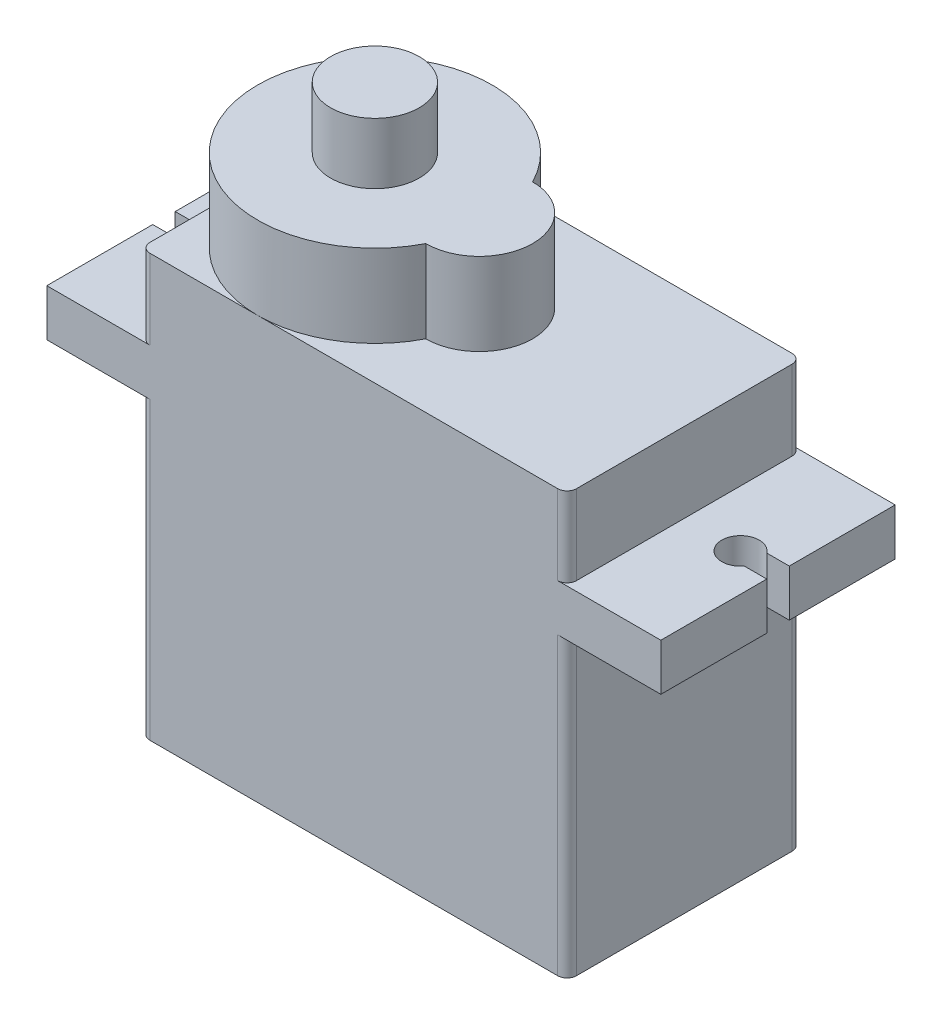
ISO-10303-21;
HEADER;
FILE_DESCRIPTION(('STEP AP214'),'2;1');
FILE_NAME('part.step','',(''),(''),'','','');
FILE_SCHEMA(('AUTOMOTIVE_DESIGN { 1 0 10303 214 1 1 1 1 }'));
ENDSEC;
DATA;
#1=APPLICATION_CONTEXT('core data for automotive mechanical design processes');
#2=APPLICATION_PROTOCOL_DEFINITION('international standard','automotive_design',2000,#1);
#3=PRODUCT_CONTEXT('',#1,'mechanical');
#4=PRODUCT('Part','Part','',(#3));
#5=PRODUCT_RELATED_PRODUCT_CATEGORY('part','',(#4));
#6=PRODUCT_DEFINITION_FORMATION('','',#4);
#7=PRODUCT_DEFINITION_CONTEXT('part definition',#1,'design');
#8=PRODUCT_DEFINITION('design','',#6,#7);
#9=PRODUCT_DEFINITION_SHAPE('','',#8);
#10=(LENGTH_UNIT() NAMED_UNIT(*) SI_UNIT(.MILLI.,.METRE.));
#11=(NAMED_UNIT(*) PLANE_ANGLE_UNIT() SI_UNIT($,.RADIAN.));
#12=(NAMED_UNIT(*) SI_UNIT($,.STERADIAN.) SOLID_ANGLE_UNIT());
#13=UNCERTAINTY_MEASURE_WITH_UNIT(LENGTH_MEASURE(1.E-05),#10,'distance_accuracy_value','');
#14=(GEOMETRIC_REPRESENTATION_CONTEXT(3) GLOBAL_UNCERTAINTY_ASSIGNED_CONTEXT((#13)) GLOBAL_UNIT_ASSIGNED_CONTEXT((#10,
#11,#12)) REPRESENTATION_CONTEXT('',''));
#15=CARTESIAN_POINT('',(0.,0.,0.));
#16=DIRECTION('',(0.,0.,1.));
#17=DIRECTION('',(1.,0.,0.));
#18=AXIS2_PLACEMENT_3D('',#15,#16,#17);
#19=CARTESIAN_POINT('',(27.75,0.,0.));
#20=DIRECTION('',(1.,0.,0.));
#21=DIRECTION('',(0.,0.,-1.));
#22=AXIS2_PLACEMENT_3D('',#19,#20,#21);
#23=PLANE('',#22);
#24=DIRECTION('',(0.,1.,0.));
#25=VECTOR('',#24,1.);
#26=CARTESIAN_POINT('',(27.75,0.,5.65));
#27=LINE('',#26,#25);
#28=CARTESIAN_POINT('',(27.75,15.75,5.65));
#29=VERTEX_POINT('',#28);
#30=CARTESIAN_POINT('',(27.75,18.25,5.65));
#31=VERTEX_POINT('',#30);
#32=EDGE_CURVE('E256',#29,#31,#27,.T.);
#33=ORIENTED_EDGE('',*,*,#32,.F.);
#34=DIRECTION('',(0.,0.,-1.));
#35=VECTOR('',#34,1.);
#36=CARTESIAN_POINT('',(27.75,15.75,12.5));
#37=LINE('',#36,#35);
#38=CARTESIAN_POINT('',(27.75,15.75,0.));
#39=VERTEX_POINT('',#38);
#40=EDGE_CURVE('E325',#29,#39,#37,.T.);
#41=ORIENTED_EDGE('',*,*,#40,.T.);
#42=DIRECTION('',(0.,1.,0.));
#43=VECTOR('',#42,1.);
#44=CARTESIAN_POINT('',(27.75,18.25,0.));
#45=LINE('',#44,#43);
#46=CARTESIAN_POINT('',(27.75,18.25,0.));
#47=VERTEX_POINT('',#46);
#48=EDGE_CURVE('E330',#39,#47,#45,.T.);
#49=ORIENTED_EDGE('',*,*,#48,.T.);
#50=DIRECTION('',(0.,0.,1.));
#51=VECTOR('',#50,1.);
#52=CARTESIAN_POINT('',(27.75,18.25,12.5));
#53=LINE('',#52,#51);
#54=EDGE_CURVE('E333',#47,#31,#53,.T.);
#55=ORIENTED_EDGE('',*,*,#54,.T.);
#56=EDGE_LOOP('',(#33,#41,#49,#55));
#57=FACE_BOUND('',#56,.T.);
#58=ADVANCED_FACE('F32',(#57),#23,.T.);
#59=CARTESIAN_POINT('',(-5.,0.,0.));
#60=DIRECTION('',(-1.,0.,0.));
#61=DIRECTION('',(0.,0.,1.));
#62=AXIS2_PLACEMENT_3D('',#59,#60,#61);
#63=PLANE('',#62);
#64=DIRECTION('',(0.,1.,0.));
#65=VECTOR('',#64,1.);
#66=CARTESIAN_POINT('',(-5.,0.,6.85));
#67=LINE('',#66,#65);
#68=CARTESIAN_POINT('',(-5.,15.75,6.85));
#69=VERTEX_POINT('',#68);
#70=CARTESIAN_POINT('',(-5.,18.25,6.85));
#71=VERTEX_POINT('',#70);
#72=EDGE_CURVE('E396',#69,#71,#67,.T.);
#73=ORIENTED_EDGE('',*,*,#72,.F.);
#74=DIRECTION('',(0.,0.,1.));
#75=VECTOR('',#74,1.);
#76=CARTESIAN_POINT('',(-5.,15.75,0.));
#77=LINE('',#76,#75);
#78=CARTESIAN_POINT('',(-5.,15.75,12.5));
#79=VERTEX_POINT('',#78);
#80=EDGE_CURVE('E298',#69,#79,#77,.T.);
#81=ORIENTED_EDGE('',*,*,#80,.T.);
#82=DIRECTION('',(0.,1.,0.));
#83=VECTOR('',#82,1.);
#84=CARTESIAN_POINT('',(-5.,18.25,12.5));
#85=LINE('',#84,#83);
#86=CARTESIAN_POINT('',(-5.,18.25,12.5));
#87=VERTEX_POINT('',#86);
#88=EDGE_CURVE('E303',#79,#87,#85,.T.);
#89=ORIENTED_EDGE('',*,*,#88,.T.);
#90=DIRECTION('',(0.,0.,-1.));
#91=VECTOR('',#90,1.);
#92=CARTESIAN_POINT('',(-5.,18.25,0.));
#93=LINE('',#92,#91);
#94=EDGE_CURVE('E306',#87,#71,#93,.T.);
#95=ORIENTED_EDGE('',*,*,#94,.T.);
#96=EDGE_LOOP('',(#73,#81,#89,#95));
#97=FACE_BOUND('',#96,.T.);
#98=ADVANCED_FACE('F518',(#97),#63,.T.);
#99=CARTESIAN_POINT('',(0.,22.5,0.));
#100=DIRECTION('',(1.,0.,0.));
#101=DIRECTION('',(0.,0.,-1.));
#102=AXIS2_PLACEMENT_3D('',#99,#100,#101);
#103=PLANE('',#102);
#104=DIRECTION('',(0.,0.,1.));
#105=VECTOR('',#104,1.);
#106=CARTESIAN_POINT('',(0.,15.75,0.));
#107=LINE('',#106,#105);
#108=CARTESIAN_POINT('',(0.,15.75,0.5));
#109=VERTEX_POINT('',#108);
#110=CARTESIAN_POINT('',(0.,15.75,12.));
#111=VERTEX_POINT('',#110);
#112=EDGE_CURVE('E294',#109,#111,#107,.T.);
#113=ORIENTED_EDGE('',*,*,#112,.F.);
#114=DIRECTION('',(0.,-1.,0.));
#115=VECTOR('',#114,1.);
#116=CARTESIAN_POINT('',(0.,22.5,0.5));
#117=LINE('',#116,#115);
#118=CARTESIAN_POINT('',(0.,0.,0.5));
#119=VERTEX_POINT('',#118);
#120=EDGE_CURVE('E403',#109,#119,#117,.T.);
#121=ORIENTED_EDGE('',*,*,#120,.T.);
#122=DIRECTION('',(0.,0.,1.));
#123=VECTOR('',#122,1.);
#124=CARTESIAN_POINT('',(0.,0.,0.));
#125=LINE('',#124,#123);
#126=CARTESIAN_POINT('',(0.,0.,12.));
#127=VERTEX_POINT('',#126);
#128=EDGE_CURVE('E367',#119,#127,#125,.T.);
#129=ORIENTED_EDGE('',*,*,#128,.T.);
#130=DIRECTION('',(0.,-1.,0.));
#131=VECTOR('',#130,1.);
#132=CARTESIAN_POINT('',(0.,22.5,12.));
#133=LINE('',#132,#131);
#134=EDGE_CURVE('E401',#127,#111,#133,.F.);
#135=ORIENTED_EDGE('',*,*,#134,.T.);
#136=EDGE_LOOP('',(#113,#121,#129,#135));
#137=FACE_BOUND('',#136,.T.);
#138=ADVANCED_FACE('F515',(#137),#103,.F.);
#139=DIRECTION('',(0.,0.,1.));
#140=VECTOR('',#139,1.);
#141=CARTESIAN_POINT('',(0.,22.5,0.));
#142=LINE('',#141,#140);
#143=CARTESIAN_POINT('',(0.,22.5,0.5));
#144=VERTEX_POINT('',#143);
#145=CARTESIAN_POINT('',(0.,22.5,6.25));
#146=VERTEX_POINT('',#145);
#147=EDGE_CURVE('E368',#144,#146,#142,.T.);
#148=ORIENTED_EDGE('',*,*,#147,.F.);
#149=DIRECTION('',(0.,-1.,0.));
#150=VECTOR('',#149,1.);
#151=CARTESIAN_POINT('',(0.,22.5,0.5));
#152=LINE('',#151,#150);
#153=CARTESIAN_POINT('',(0.,18.25,0.5));
#154=VERTEX_POINT('',#153);
#155=EDGE_CURVE('E441',#144,#154,#152,.T.);
#156=ORIENTED_EDGE('',*,*,#155,.T.);
#157=DIRECTION('',(0.,0.,-1.));
#158=VECTOR('',#157,1.);
#159=CARTESIAN_POINT('',(0.,18.25,0.));
#160=LINE('',#159,#158);
#161=CARTESIAN_POINT('',(0.,18.25,12.));
#162=VERTEX_POINT('',#161);
#163=EDGE_CURVE('E299',#162,#154,#160,.T.);
#164=ORIENTED_EDGE('',*,*,#163,.F.);
#165=DIRECTION('',(0.,-1.,0.));
#166=VECTOR('',#165,1.);
#167=CARTESIAN_POINT('',(0.,22.5,12.));
#168=LINE('',#167,#166);
#169=CARTESIAN_POINT('',(0.,22.5,12.));
#170=VERTEX_POINT('',#169);
#171=EDGE_CURVE('E439',#162,#170,#168,.F.);
#172=ORIENTED_EDGE('',*,*,#171,.T.);
#173=EDGE_CURVE('E371',#146,#170,#142,.T.);
#174=ORIENTED_EDGE('',*,*,#173,.F.);
#175=EDGE_LOOP('',(#148,#156,#164,#172,#174));
#176=FACE_BOUND('',#175,.T.);
#177=ADVANCED_FACE('F517',(#176),#103,.F.);
#178=CARTESIAN_POINT('',(22.75,22.5,0.));
#179=DIRECTION('',(-1.,0.,0.));
#180=DIRECTION('',(0.,0.,1.));
#181=AXIS2_PLACEMENT_3D('',#178,#179,#180);
#182=PLANE('',#181);
#183=DIRECTION('',(0.,0.,1.));
#184=VECTOR('',#183,1.);
#185=CARTESIAN_POINT('',(22.75,18.25,12.5));
#186=LINE('',#185,#184);
#187=CARTESIAN_POINT('',(22.75,18.25,0.5));
#188=VERTEX_POINT('',#187);
#189=CARTESIAN_POINT('',(22.75,18.25,12.));
#190=VERTEX_POINT('',#189);
#191=EDGE_CURVE('E326',#188,#190,#186,.T.);
#192=ORIENTED_EDGE('',*,*,#191,.F.);
#193=DIRECTION('',(0.,-1.,0.));
#194=VECTOR('',#193,1.);
#195=CARTESIAN_POINT('',(22.75,22.5,0.5));
#196=LINE('',#195,#194);
#197=CARTESIAN_POINT('',(22.75,22.5,0.5));
#198=VERTEX_POINT('',#197);
#199=EDGE_CURVE('E433',#188,#198,#196,.F.);
#200=ORIENTED_EDGE('',*,*,#199,.T.);
#201=DIRECTION('',(0.,0.,-1.));
#202=VECTOR('',#201,1.);
#203=CARTESIAN_POINT('',(22.75,22.5,0.));
#204=LINE('',#203,#202);
#205=CARTESIAN_POINT('',(22.75,22.5,12.));
#206=VERTEX_POINT('',#205);
#207=EDGE_CURVE('E374',#206,#198,#204,.T.);
#208=ORIENTED_EDGE('',*,*,#207,.F.);
#209=DIRECTION('',(0.,-1.,0.));
#210=VECTOR('',#209,1.);
#211=CARTESIAN_POINT('',(22.75,22.5,12.));
#212=LINE('',#211,#210);
#213=EDGE_CURVE('E430',#206,#190,#212,.T.);
#214=ORIENTED_EDGE('',*,*,#213,.T.);
#215=EDGE_LOOP('',(#192,#200,#208,#214));
#216=FACE_BOUND('',#215,.T.);
#217=ADVANCED_FACE('F524',(#216),#182,.F.);
#218=DIRECTION('',(0.,0.,-1.));
#219=VECTOR('',#218,1.);
#220=CARTESIAN_POINT('',(22.75,0.,0.));
#221=LINE('',#220,#219);
#222=CARTESIAN_POINT('',(22.75,0.,12.));
#223=VERTEX_POINT('',#222);
#224=CARTESIAN_POINT('',(22.75,0.,0.5));
#225=VERTEX_POINT('',#224);
#226=EDGE_CURVE('E385',#223,#225,#221,.T.);
#227=ORIENTED_EDGE('',*,*,#226,.T.);
#228=DIRECTION('',(0.,-1.,0.));
#229=VECTOR('',#228,1.);
#230=CARTESIAN_POINT('',(22.75,22.5,0.5));
#231=LINE('',#230,#229);
#232=CARTESIAN_POINT('',(22.75,15.75,0.5));
#233=VERTEX_POINT('',#232);
#234=EDGE_CURVE('E428',#225,#233,#231,.F.);
#235=ORIENTED_EDGE('',*,*,#234,.T.);
#236=DIRECTION('',(0.,0.,-1.));
#237=VECTOR('',#236,1.);
#238=CARTESIAN_POINT('',(22.75,15.75,12.5));
#239=LINE('',#238,#237);
#240=CARTESIAN_POINT('',(22.75,15.75,12.));
#241=VERTEX_POINT('',#240);
#242=EDGE_CURVE('E321',#241,#233,#239,.T.);
#243=ORIENTED_EDGE('',*,*,#242,.F.);
#244=DIRECTION('',(0.,-1.,0.));
#245=VECTOR('',#244,1.);
#246=CARTESIAN_POINT('',(22.75,22.5,12.));
#247=LINE('',#246,#245);
#248=EDGE_CURVE('E425',#241,#223,#247,.T.);
#249=ORIENTED_EDGE('',*,*,#248,.T.);
#250=EDGE_LOOP('',(#227,#235,#243,#249));
#251=FACE_BOUND('',#250,.T.);
#252=ADVANCED_FACE('F496',(#251),#182,.F.);
#253=CARTESIAN_POINT('',(0.,22.5,0.));
#254=DIRECTION('',(0.,1.,0.));
#255=DIRECTION('',(0.,0.,1.));
#256=AXIS2_PLACEMENT_3D('',#253,#254,#255);
#257=PLANE('',#256);
#258=ORIENTED_EDGE('',*,*,#207,.T.);
#259=CARTESIAN_POINT('',(22.25,22.5,0.5));
#260=DIRECTION('',(0.,1.,0.));
#261=DIRECTION('',(0.,0.,1.));
#262=AXIS2_PLACEMENT_3D('',#259,#260,#261);
#263=CIRCLE('',#262,0.5);
#264=CARTESIAN_POINT('',(22.25,22.5,0.));
#265=VERTEX_POINT('',#264);
#266=EDGE_CURVE('E437',#198,#265,#263,.T.);
#267=ORIENTED_EDGE('',*,*,#266,.T.);
#268=DIRECTION('',(-1.,0.,0.));
#269=VECTOR('',#268,1.);
#270=CARTESIAN_POINT('',(0.,22.5,0.));
#271=LINE('',#270,#269);
#272=CARTESIAN_POINT('',(6.25,22.5,0.));
#273=VERTEX_POINT('',#272);
#274=EDGE_CURVE('E378',#265,#273,#271,.T.);
#275=ORIENTED_EDGE('',*,*,#274,.T.);
#276=CARTESIAN_POINT('',(6.25,22.5,6.25));
#277=DIRECTION('',(0.,1.,0.));
#278=DIRECTION('',(0.,0.,1.));
#279=AXIS2_PLACEMENT_3D('',#276,#277,#278);
#280=CIRCLE('',#279,6.25);
#281=CARTESIAN_POINT('',(11.8123735940694,22.5,3.4));
#282=VERTEX_POINT('',#281);
#283=EDGE_CURVE('E353',#282,#273,#280,.T.);
#284=ORIENTED_EDGE('',*,*,#283,.F.);
#285=CARTESIAN_POINT('',(11.8123735940694,22.5,6.25));
#286=DIRECTION('',(0.,1.,0.));
#287=DIRECTION('',(0.,0.,-1.));
#288=AXIS2_PLACEMENT_3D('',#285,#286,#287);
#289=CIRCLE('',#288,2.85);
#290=CARTESIAN_POINT('',(11.8123735940694,22.5,9.1));
#291=VERTEX_POINT('',#290);
#292=EDGE_CURVE('E348',#291,#282,#289,.T.);
#293=ORIENTED_EDGE('',*,*,#292,.F.);
#294=CARTESIAN_POINT('',(6.25,22.5,12.5));
#295=VERTEX_POINT('',#294);
#296=EDGE_CURVE('E361',#295,#291,#280,.T.);
#297=ORIENTED_EDGE('',*,*,#296,.F.);
#298=DIRECTION('',(1.,0.,0.));
#299=VECTOR('',#298,1.);
#300=CARTESIAN_POINT('',(0.,22.5,12.5));
#301=LINE('',#300,#299);
#302=CARTESIAN_POINT('',(22.25,22.5,12.5));
#303=VERTEX_POINT('',#302);
#304=EDGE_CURVE('E370',#295,#303,#301,.T.);
#305=ORIENTED_EDGE('',*,*,#304,.T.);
#306=CARTESIAN_POINT('',(22.25,22.5,12.));
#307=DIRECTION('',(0.,1.,0.));
#308=DIRECTION('',(0.,0.,1.));
#309=AXIS2_PLACEMENT_3D('',#306,#307,#308);
#310=CIRCLE('',#309,0.5);
#311=EDGE_CURVE('E435',#303,#206,#310,.T.);
#312=ORIENTED_EDGE('',*,*,#311,.T.);
#313=EDGE_LOOP('',(#258,#267,#275,#284,#293,#297,#305,#312));
#314=FACE_BOUND('',#313,.T.);
#315=ADVANCED_FACE('F560',(#314),#257,.T.);
#316=CARTESIAN_POINT('',(0.5,22.5,0.));
#317=VERTEX_POINT('',#316);
#318=EDGE_CURVE('E377',#273,#317,#271,.T.);
#319=ORIENTED_EDGE('',*,*,#318,.T.);
#320=CARTESIAN_POINT('',(0.5,22.5,0.5));
#321=DIRECTION('',(0.,1.,0.));
#322=DIRECTION('',(0.,0.,1.));
#323=AXIS2_PLACEMENT_3D('',#320,#321,#322);
#324=CIRCLE('',#323,0.5);
#325=EDGE_CURVE('E444',#317,#144,#324,.T.);
#326=ORIENTED_EDGE('',*,*,#325,.T.);
#327=ORIENTED_EDGE('',*,*,#147,.T.);
#328=EDGE_CURVE('E360',#273,#146,#280,.T.);
#329=ORIENTED_EDGE('',*,*,#328,.F.);
#330=EDGE_LOOP('',(#319,#326,#327,#329));
#331=FACE_BOUND('',#330,.T.);
#332=ADVANCED_FACE('F573',(#331),#257,.T.);
#333=CARTESIAN_POINT('',(0.,22.5,12.5));
#334=DIRECTION('',(0.,0.,-1.));
#335=DIRECTION('',(-1.,0.,0.));
#336=AXIS2_PLACEMENT_3D('',#333,#334,#335);
#337=PLANE('',#336);
#338=DIRECTION('',(-1.,0.,0.));
#339=VECTOR('',#338,1.);
#340=CARTESIAN_POINT('',(27.75,18.25,12.5));
#341=LINE('',#340,#339);
#342=CARTESIAN_POINT('',(27.75,18.25,12.5));
#343=VERTEX_POINT('',#342);
#344=CARTESIAN_POINT('',(22.25,18.25,12.5));
#345=VERTEX_POINT('',#344);
#346=EDGE_CURVE('E47',#343,#345,#341,.T.);
#347=ORIENTED_EDGE('',*,*,#346,.T.);
#348=DIRECTION('',(0.,-1.,0.));
#349=VECTOR('',#348,1.);
#350=CARTESIAN_POINT('',(22.25,22.5,12.5));
#351=LINE('',#350,#349);
#352=EDGE_CURVE('E454',#345,#303,#351,.F.);
#353=ORIENTED_EDGE('',*,*,#352,.T.);
#354=ORIENTED_EDGE('',*,*,#304,.F.);
#355=CARTESIAN_POINT('',(0.500000000000001,22.5,12.5));
#356=VERTEX_POINT('',#355);
#357=EDGE_CURVE('E372',#356,#295,#301,.T.);
#358=ORIENTED_EDGE('',*,*,#357,.F.);
#359=DIRECTION('',(0.,-1.,0.));
#360=VECTOR('',#359,1.);
#361=CARTESIAN_POINT('',(0.500000000000001,22.5,12.5));
#362=LINE('',#361,#360);
#363=CARTESIAN_POINT('',(0.500000000000001,18.25,12.5));
#364=VERTEX_POINT('',#363);
#365=EDGE_CURVE('E446',#356,#364,#362,.T.);
#366=ORIENTED_EDGE('',*,*,#365,.T.);
#367=DIRECTION('',(1.,0.,0.));
#368=VECTOR('',#367,1.);
#369=CARTESIAN_POINT('',(-5.,18.25,12.5));
#370=LINE('',#369,#368);
#371=EDGE_CURVE('E315',#87,#364,#370,.T.);
#372=ORIENTED_EDGE('',*,*,#371,.F.);
#373=ORIENTED_EDGE('',*,*,#88,.F.);
#374=DIRECTION('',(1.,0.,0.));
#375=VECTOR('',#374,1.);
#376=CARTESIAN_POINT('',(-5.,15.75,12.5));
#377=LINE('',#376,#375);
#378=CARTESIAN_POINT('',(0.500000000000001,15.75,12.5));
#379=VERTEX_POINT('',#378);
#380=EDGE_CURVE('E317',#79,#379,#377,.T.);
#381=ORIENTED_EDGE('',*,*,#380,.T.);
#382=DIRECTION('',(0.,-1.,0.));
#383=VECTOR('',#382,1.);
#384=CARTESIAN_POINT('',(0.500000000000001,22.5,12.5));
#385=LINE('',#384,#383);
#386=CARTESIAN_POINT('',(0.500000000000001,0.,12.5));
#387=VERTEX_POINT('',#386);
#388=EDGE_CURVE('E449',#379,#387,#385,.T.);
#389=ORIENTED_EDGE('',*,*,#388,.T.);
#390=DIRECTION('',(1.,0.,0.));
#391=VECTOR('',#390,1.);
#392=CARTESIAN_POINT('',(0.,0.,12.5));
#393=LINE('',#392,#391);
#394=CARTESIAN_POINT('',(22.25,0.,12.5));
#395=VERTEX_POINT('',#394);
#396=EDGE_CURVE('E382',#387,#395,#393,.T.);
#397=ORIENTED_EDGE('',*,*,#396,.T.);
#398=DIRECTION('',(0.,-1.,0.));
#399=VECTOR('',#398,1.);
#400=CARTESIAN_POINT('',(22.25,22.5,12.5));
#401=LINE('',#400,#399);
#402=CARTESIAN_POINT('',(22.25,15.75,12.5));
#403=VERTEX_POINT('',#402);
#404=EDGE_CURVE('E452',#395,#403,#401,.F.);
#405=ORIENTED_EDGE('',*,*,#404,.T.);
#406=DIRECTION('',(-1.,0.,0.));
#407=VECTOR('',#406,1.);
#408=CARTESIAN_POINT('',(27.75,15.75,12.5));
#409=LINE('',#408,#407);
#410=CARTESIAN_POINT('',(27.75,15.75,12.5));
#411=VERTEX_POINT('',#410);
#412=EDGE_CURVE('E55',#411,#403,#409,.T.);
#413=ORIENTED_EDGE('',*,*,#412,.F.);
#414=DIRECTION('',(0.,-1.,0.));
#415=VECTOR('',#414,1.);
#416=CARTESIAN_POINT('',(27.75,18.25,12.5));
#417=LINE('',#416,#415);
#418=EDGE_CURVE('E322',#343,#411,#417,.T.);
#419=ORIENTED_EDGE('',*,*,#418,.F.);
#420=EDGE_LOOP('',(#347,#353,#354,#358,#366,#372,#373,#381,#389,#397,#405,#413,#419));
#421=FACE_BOUND('',#420,.T.);
#422=ADVANCED_FACE('F484',(#421),#337,.F.);
#423=CARTESIAN_POINT('',(0.,22.5,0.));
#424=DIRECTION('',(0.,0.,1.));
#425=DIRECTION('',(1.,0.,0.));
#426=AXIS2_PLACEMENT_3D('',#423,#424,#425);
#427=PLANE('',#426);
#428=DIRECTION('',(-1.,0.,0.));
#429=VECTOR('',#428,1.);
#430=CARTESIAN_POINT('',(0.,0.,0.));
#431=LINE('',#430,#429);
#432=CARTESIAN_POINT('',(22.25,0.,0.));
#433=VERTEX_POINT('',#432);
#434=CARTESIAN_POINT('',(0.5,0.,0.));
#435=VERTEX_POINT('',#434);
#436=EDGE_CURVE('E388',#433,#435,#431,.T.);
#437=ORIENTED_EDGE('',*,*,#436,.T.);
#438=DIRECTION('',(0.,-1.,0.));
#439=VECTOR('',#438,1.);
#440=CARTESIAN_POINT('',(0.5,22.5,0.));
#441=LINE('',#440,#439);
#442=CARTESIAN_POINT('',(0.5,15.75,0.));
#443=VERTEX_POINT('',#442);
#444=EDGE_CURVE('E422',#435,#443,#441,.F.);
#445=ORIENTED_EDGE('',*,*,#444,.T.);
#446=DIRECTION('',(1.,0.,0.));
#447=VECTOR('',#446,1.);
#448=CARTESIAN_POINT('',(-5.,15.75,0.));
#449=LINE('',#448,#447);
#450=CARTESIAN_POINT('',(-5.,15.75,0.));
#451=VERTEX_POINT('',#450);
#452=EDGE_CURVE('E319',#451,#443,#449,.T.);
#453=ORIENTED_EDGE('',*,*,#452,.F.);
#454=DIRECTION('',(0.,-1.,0.));
#455=VECTOR('',#454,1.);
#456=CARTESIAN_POINT('',(-5.,18.25,0.));
#457=LINE('',#456,#455);
#458=CARTESIAN_POINT('',(-5.,18.25,0.));
#459=VERTEX_POINT('',#458);
#460=EDGE_CURVE('E295',#459,#451,#457,.T.);
#461=ORIENTED_EDGE('',*,*,#460,.F.);
#462=DIRECTION('',(1.,0.,0.));
#463=VECTOR('',#462,1.);
#464=CARTESIAN_POINT('',(-5.,18.25,0.));
#465=LINE('',#464,#463);
#466=CARTESIAN_POINT('',(0.5,18.25,0.));
#467=VERTEX_POINT('',#466);
#468=EDGE_CURVE('E309',#459,#467,#465,.T.);
#469=ORIENTED_EDGE('',*,*,#468,.T.);
#470=DIRECTION('',(0.,-1.,0.));
#471=VECTOR('',#470,1.);
#472=CARTESIAN_POINT('',(0.5,22.5,0.));
#473=LINE('',#472,#471);
#474=EDGE_CURVE('E414',#467,#317,#473,.F.);
#475=ORIENTED_EDGE('',*,*,#474,.T.);
#476=ORIENTED_EDGE('',*,*,#318,.F.);
#477=ORIENTED_EDGE('',*,*,#274,.F.);
#478=DIRECTION('',(0.,-1.,0.));
#479=VECTOR('',#478,1.);
#480=CARTESIAN_POINT('',(22.25,22.5,0.));
#481=LINE('',#480,#479);
#482=CARTESIAN_POINT('',(22.25,18.25,0.));
#483=VERTEX_POINT('',#482);
#484=EDGE_CURVE('E416',#265,#483,#481,.T.);
#485=ORIENTED_EDGE('',*,*,#484,.T.);
#486=DIRECTION('',(-1.,0.,0.));
#487=VECTOR('',#486,1.);
#488=CARTESIAN_POINT('',(27.75,18.25,0.));
#489=LINE('',#488,#487);
#490=EDGE_CURVE('E340',#47,#483,#489,.T.);
#491=ORIENTED_EDGE('',*,*,#490,.F.);
#492=ORIENTED_EDGE('',*,*,#48,.F.);
#493=DIRECTION('',(-1.,0.,0.));
#494=VECTOR('',#493,1.);
#495=CARTESIAN_POINT('',(27.75,15.75,0.));
#496=LINE('',#495,#494);
#497=CARTESIAN_POINT('',(22.25,15.75,0.));
#498=VERTEX_POINT('',#497);
#499=EDGE_CURVE('E342',#39,#498,#496,.T.);
#500=ORIENTED_EDGE('',*,*,#499,.T.);
#501=DIRECTION('',(0.,-1.,0.));
#502=VECTOR('',#501,1.);
#503=CARTESIAN_POINT('',(22.25,22.5,0.));
#504=LINE('',#503,#502);
#505=EDGE_CURVE('E419',#498,#433,#504,.T.);
#506=ORIENTED_EDGE('',*,*,#505,.T.);
#507=EDGE_LOOP('',(#437,#445,#453,#461,#469,#475,#476,#477,#485,#491,#492,#500,#506));
#508=FACE_BOUND('',#507,.T.);
#509=ADVANCED_FACE('F507',(#508),#427,.F.);
#510=ORIENTED_EDGE('',*,*,#173,.T.);
#511=CARTESIAN_POINT('',(0.500000000000001,22.5,12.));
#512=DIRECTION('',(0.,1.,0.));
#513=DIRECTION('',(0.,0.,1.));
#514=AXIS2_PLACEMENT_3D('',#511,#512,#513);
#515=CIRCLE('',#514,0.5);
#516=EDGE_CURVE('E456',#170,#356,#515,.T.);
#517=ORIENTED_EDGE('',*,*,#516,.T.);
#518=ORIENTED_EDGE('',*,*,#357,.T.);
#519=EDGE_CURVE('E565',#146,#295,#280,.T.);
#520=ORIENTED_EDGE('',*,*,#519,.F.);
#521=EDGE_LOOP('',(#510,#517,#518,#520));
#522=FACE_BOUND('',#521,.T.);
#523=ADVANCED_FACE('F590',(#522),#257,.T.);
#524=CARTESIAN_POINT('',(0.,0.,0.));
#525=DIRECTION('',(0.,1.,0.));
#526=DIRECTION('',(0.,0.,1.));
#527=AXIS2_PLACEMENT_3D('',#524,#525,#526);
#528=PLANE('',#527);
#529=ORIENTED_EDGE('',*,*,#128,.F.);
#530=CARTESIAN_POINT('',(0.5,0.,0.5));
#531=DIRECTION('',(0.,1.,0.));
#532=DIRECTION('',(0.,0.,1.));
#533=AXIS2_PLACEMENT_3D('',#530,#531,#532);
#534=CIRCLE('',#533,0.5);
#535=EDGE_CURVE('E412',#119,#435,#534,.F.);
#536=ORIENTED_EDGE('',*,*,#535,.T.);
#537=ORIENTED_EDGE('',*,*,#436,.F.);
#538=CARTESIAN_POINT('',(22.25,0.,0.5));
#539=DIRECTION('',(0.,1.,0.));
#540=DIRECTION('',(0.,0.,1.));
#541=AXIS2_PLACEMENT_3D('',#538,#539,#540);
#542=CIRCLE('',#541,0.5);
#543=EDGE_CURVE('E410',#433,#225,#542,.F.);
#544=ORIENTED_EDGE('',*,*,#543,.T.);
#545=ORIENTED_EDGE('',*,*,#226,.F.);
#546=CARTESIAN_POINT('',(22.25,0.,12.));
#547=DIRECTION('',(0.,1.,0.));
#548=DIRECTION('',(0.,0.,1.));
#549=AXIS2_PLACEMENT_3D('',#546,#547,#548);
#550=CIRCLE('',#549,0.5);
#551=EDGE_CURVE('E408',#223,#395,#550,.F.);
#552=ORIENTED_EDGE('',*,*,#551,.T.);
#553=ORIENTED_EDGE('',*,*,#396,.F.);
#554=CARTESIAN_POINT('',(0.500000000000001,0.,12.));
#555=DIRECTION('',(0.,1.,0.));
#556=DIRECTION('',(0.,0.,1.));
#557=AXIS2_PLACEMENT_3D('',#554,#555,#556);
#558=CIRCLE('',#557,0.5);
#559=EDGE_CURVE('E406',#387,#127,#558,.F.);
#560=ORIENTED_EDGE('',*,*,#559,.T.);
#561=EDGE_LOOP('',(#529,#536,#537,#544,#545,#552,#553,#560));
#562=FACE_BOUND('',#561,.T.);
#563=ADVANCED_FACE('F488',(#562),#528,.F.);
#564=CARTESIAN_POINT('',(11.8123735940694,26.9,6.25));
#565=DIRECTION('',(0.,-1.,0.));
#566=DIRECTION('',(0.,0.,-1.));
#567=AXIS2_PLACEMENT_3D('',#564,#565,#566);
#568=CYLINDRICAL_SURFACE('',#567,2.85);
#569=ORIENTED_EDGE('',*,*,#292,.T.);
#570=DIRECTION('',(0.,-1.,0.));
#571=VECTOR('',#570,1.);
#572=CARTESIAN_POINT('',(11.8123735940694,26.9,3.4));
#573=LINE('',#572,#571);
#574=CARTESIAN_POINT('',(11.8123735940694,26.9,3.4));
#575=VERTEX_POINT('',#574);
#576=EDGE_CURVE('E364',#575,#282,#573,.T.);
#577=ORIENTED_EDGE('',*,*,#576,.F.);
#578=CARTESIAN_POINT('',(11.8123735940694,26.9,6.25));
#579=DIRECTION('',(0.,1.,0.));
#580=DIRECTION('',(0.,0.,-1.));
#581=AXIS2_PLACEMENT_3D('',#578,#579,#580);
#582=CIRCLE('',#581,2.85);
#583=CARTESIAN_POINT('',(11.8123735940694,26.9,9.1));
#584=VERTEX_POINT('',#583);
#585=EDGE_CURVE('E349',#584,#575,#582,.T.);
#586=ORIENTED_EDGE('',*,*,#585,.F.);
#587=DIRECTION('',(0.,-1.,0.));
#588=VECTOR('',#587,1.);
#589=CARTESIAN_POINT('',(11.8123735940694,26.9,9.1));
#590=LINE('',#589,#588);
#591=EDGE_CURVE('E355',#584,#291,#590,.T.);
#592=ORIENTED_EDGE('',*,*,#591,.T.);
#593=EDGE_LOOP('',(#569,#577,#586,#592));
#594=FACE_BOUND('',#593,.T.);
#595=ADVANCED_FACE('F644',(#594),#568,.T.);
#596=CARTESIAN_POINT('',(6.25,26.9,6.25));
#597=DIRECTION('',(0.,-1.,0.));
#598=DIRECTION('',(0.,0.,-1.));
#599=AXIS2_PLACEMENT_3D('',#596,#597,#598);
#600=CYLINDRICAL_SURFACE('',#599,6.25);
#601=ORIENTED_EDGE('',*,*,#283,.T.);
#602=ORIENTED_EDGE('',*,*,#328,.T.);
#603=ORIENTED_EDGE('',*,*,#519,.T.);
#604=ORIENTED_EDGE('',*,*,#296,.T.);
#605=ORIENTED_EDGE('',*,*,#591,.F.);
#606=CARTESIAN_POINT('',(6.25,26.9,6.25));
#607=DIRECTION('',(0.,1.,0.));
#608=DIRECTION('',(0.,0.,1.));
#609=AXIS2_PLACEMENT_3D('',#606,#607,#608);
#610=CIRCLE('',#609,6.25);
#611=EDGE_CURVE('E352',#575,#584,#610,.T.);
#612=ORIENTED_EDGE('',*,*,#611,.F.);
#613=ORIENTED_EDGE('',*,*,#576,.T.);
#614=EDGE_LOOP('',(#601,#602,#603,#604,#605,#612,#613));
#615=FACE_BOUND('',#614,.T.);
#616=ADVANCED_FACE('F569',(#615),#600,.T.);
#617=CARTESIAN_POINT('',(9.03118679703468,26.9,6.25));
#618=DIRECTION('',(0.,-1.,0.));
#619=DIRECTION('',(0.,0.,-1.));
#620=AXIS2_PLACEMENT_3D('',#617,#618,#619);
#621=PLANE('',#620);
#622=CARTESIAN_POINT('',(6.25,26.9,6.25));
#623=DIRECTION('',(0.,-1.,0.));
#624=DIRECTION('',(0.,0.,-1.));
#625=AXIS2_PLACEMENT_3D('',#622,#623,#624);
#626=CIRCLE('',#625,2.365);
#627=CARTESIAN_POINT('',(6.25,26.9,3.885));
#628=VERTEX_POINT('',#627);
#629=EDGE_CURVE('E391',#628,#628,#626,.F.);
#630=ORIENTED_EDGE('',*,*,#629,.F.);
#631=EDGE_LOOP('',(#630));
#632=FACE_BOUND('',#631,.T.);
#633=ORIENTED_EDGE('',*,*,#585,.T.);
#634=ORIENTED_EDGE('',*,*,#611,.T.);
#635=EDGE_LOOP('',(#633,#634));
#636=FACE_BOUND('',#635,.T.);
#637=ADVANCED_FACE('F646',(#632,#636),#621,.F.);
#638=CARTESIAN_POINT('',(6.25,30.15,6.25));
#639=DIRECTION('',(0.,-1.,0.));
#640=DIRECTION('',(0.,0.,-1.));
#641=AXIS2_PLACEMENT_3D('',#638,#639,#640);
#642=CYLINDRICAL_SURFACE('',#641,2.365);
#643=CARTESIAN_POINT('',(6.25,30.15,6.25));
#644=DIRECTION('',(0.,1.,0.));
#645=DIRECTION('',(0.,0.,1.));
#646=AXIS2_PLACEMENT_3D('',#643,#644,#645);
#647=CIRCLE('',#646,2.365);
#648=CARTESIAN_POINT('',(6.25,30.15,3.885));
#649=VERTEX_POINT('',#648);
#650=EDGE_CURVE('E345',#649,#649,#647,.T.);
#651=CARTESIAN_POINT('',(6.25,30.15,3.885));
#652=CARTESIAN_POINT('',(6.25,30.1161458333333,3.885));
#653=CARTESIAN_POINT('',(6.25,30.0822916666667,3.885));
#654=CARTESIAN_POINT('',(6.25,30.0145833333333,3.885));
#655=CARTESIAN_POINT('',(6.25,29.9807291666667,3.885));
#656=CARTESIAN_POINT('',(6.25,29.9130208333333,3.885));
#657=CARTESIAN_POINT('',(6.25,29.8791666666667,3.885));
#658=CARTESIAN_POINT('',(6.25,29.8114583333333,3.885));
#659=CARTESIAN_POINT('',(6.25,29.7776041666667,3.885));
#660=CARTESIAN_POINT('',(6.25,29.7098958333333,3.885));
#661=CARTESIAN_POINT('',(6.25,29.6760416666667,3.885));
#662=CARTESIAN_POINT('',(6.25,29.6083333333333,3.885));
#663=CARTESIAN_POINT('',(6.25,29.5744791666667,3.885));
#664=CARTESIAN_POINT('',(6.25,29.5067708333333,3.885));
#665=CARTESIAN_POINT('',(6.25,29.4729166666667,3.885));
#666=CARTESIAN_POINT('',(6.25,29.4052083333333,3.885));
#667=CARTESIAN_POINT('',(6.25,29.3713541666667,3.885));
#668=CARTESIAN_POINT('',(6.25,29.3036458333333,3.885));
#669=CARTESIAN_POINT('',(6.25,29.2697916666667,3.885));
#670=CARTESIAN_POINT('',(6.25,29.2020833333333,3.885));
#671=CARTESIAN_POINT('',(6.25,29.1682291666667,3.885));
#672=CARTESIAN_POINT('',(6.25,29.1005208333333,3.885));
#673=CARTESIAN_POINT('',(6.25,29.0666666666667,3.885));
#674=CARTESIAN_POINT('',(6.25,28.9989583333333,3.885));
#675=CARTESIAN_POINT('',(6.25,28.9651041666667,3.885));
#676=CARTESIAN_POINT('',(6.25,28.8973958333333,3.885));
#677=CARTESIAN_POINT('',(6.25,28.8635416666667,3.885));
#678=CARTESIAN_POINT('',(6.25,28.7958333333333,3.885));
#679=CARTESIAN_POINT('',(6.25,28.7619791666667,3.885));
#680=CARTESIAN_POINT('',(6.25,28.6942708333333,3.885));
#681=CARTESIAN_POINT('',(6.25,28.6604166666667,3.885));
#682=CARTESIAN_POINT('',(6.25,28.5927083333333,3.885));
#683=CARTESIAN_POINT('',(6.25,28.5588541666667,3.885));
#684=CARTESIAN_POINT('',(6.25,28.4911458333333,3.885));
#685=CARTESIAN_POINT('',(6.25,28.4572916666667,3.885));
#686=CARTESIAN_POINT('',(6.25,28.3895833333333,3.885));
#687=CARTESIAN_POINT('',(6.25,28.3557291666667,3.885));
#688=CARTESIAN_POINT('',(6.25,28.2880208333333,3.885));
#689=CARTESIAN_POINT('',(6.25,28.2541666666667,3.885));
#690=CARTESIAN_POINT('',(6.25,28.1864583333333,3.885));
#691=CARTESIAN_POINT('',(6.25,28.1526041666667,3.885));
#692=CARTESIAN_POINT('',(6.25,28.0848958333333,3.885));
#693=CARTESIAN_POINT('',(6.25,28.0510416666667,3.885));
#694=CARTESIAN_POINT('',(6.25,27.9833333333333,3.885));
#695=CARTESIAN_POINT('',(6.25,27.9494791666667,3.885));
#696=CARTESIAN_POINT('',(6.25,27.8817708333333,3.885));
#697=CARTESIAN_POINT('',(6.25,27.8479166666667,3.885));
#698=CARTESIAN_POINT('',(6.25,27.7802083333333,3.885));
#699=CARTESIAN_POINT('',(6.25,27.7463541666667,3.885));
#700=CARTESIAN_POINT('',(6.25,27.6786458333333,3.885));
#701=CARTESIAN_POINT('',(6.25,27.6447916666667,3.885));
#702=CARTESIAN_POINT('',(6.25,27.5770833333333,3.885));
#703=CARTESIAN_POINT('',(6.25,27.5432291666667,3.885));
#704=CARTESIAN_POINT('',(6.25,27.4755208333333,3.885));
#705=CARTESIAN_POINT('',(6.25,27.4416666666667,3.885));
#706=CARTESIAN_POINT('',(6.25,27.3739583333333,3.885));
#707=CARTESIAN_POINT('',(6.25,27.3401041666667,3.885));
#708=CARTESIAN_POINT('',(6.25,27.2723958333333,3.885));
#709=CARTESIAN_POINT('',(6.25,27.2385416666667,3.885));
#710=CARTESIAN_POINT('',(6.25,27.1708333333333,3.885));
#711=CARTESIAN_POINT('',(6.25,27.1369791666667,3.885));
#712=CARTESIAN_POINT('',(6.25,27.0692708333333,3.885));
#713=CARTESIAN_POINT('',(6.25,27.0354166666667,3.885));
#714=CARTESIAN_POINT('',(6.25,26.9677083333333,3.885));
#715=CARTESIAN_POINT('',(6.25,26.9338541666667,3.885));
#716=CARTESIAN_POINT('',(6.25,26.9,3.885));
#717=B_SPLINE_CURVE_WITH_KNOTS('',3,(#651,#652,#653,#654,#655,#656,#657,#658,#659,#660,#661,
#662,#663,#664,#665,#666,#667,#668,#669,#670,#671,#672,#673,#674,#675,#676,#677,#678,#679,#680,
#681,#682,#683,#684,#685,#686,#687,#688,#689,#690,#691,#692,#693,#694,#695,#696,#697,#698,#699,
#700,#701,#702,#703,#704,#705,#706,#707,#708,#709,#710,#711,#712,#713,#714,#715,#716),
.UNSPECIFIED.,.F.,.F.,(4,2,2,2,2,2,2,2,2,2,2,2,2,2,2,2,2,2,2,2,2,2,2,2,2,2,2,2,2,2,2,2,4),(0.,
0.101562499999999,0.203124999999998,0.304687499999998,0.406249999999997,0.507812499999996,
0.609374999999999,0.710937499999998,0.812499999999997,0.914062499999996,1.015625,1.1171875,
1.21875,1.3203125,1.421875,1.5234375,1.62499999999999,1.7265625,1.828125,1.9296875,
2.03124999999999,2.13281249999999,2.234375,2.3359375,2.4375,2.53906249999999,2.64062499999999,
2.74218749999999,2.84375,2.94531249999999,3.04687499999999,3.14843749999999,3.24999999999999),.UNSPECIFIED.);
#718=EDGE_CURVE('BSEAM648',#649,#628,#717,.T.);
#719=ORIENTED_EDGE('',*,*,#650,.F.);
#720=ORIENTED_EDGE('',*,*,#629,.T.);
#721=ORIENTED_EDGE('',*,*,#718,.T.);
#722=ORIENTED_EDGE('',*,*,#718,.F.);
#723=EDGE_LOOP('',(#719,#721,#720,#722));
#724=FACE_BOUND('',#723,.T.);
#725=ADVANCED_FACE('F648',(#724),#642,.T.);
#726=CARTESIAN_POINT('',(6.25,30.15,6.25));
#727=DIRECTION('',(0.,1.,0.));
#728=DIRECTION('',(0.,0.,1.));
#729=AXIS2_PLACEMENT_3D('',#726,#727,#728);
#730=PLANE('',#729);
#731=ORIENTED_EDGE('',*,*,#650,.T.);
#732=EDGE_LOOP('',(#731));
#733=FACE_BOUND('',#732,.T.);
#734=ADVANCED_FACE('F655',(#733),#730,.T.);
#735=CARTESIAN_POINT('',(27.75,15.75,12.5));
#736=DIRECTION('',(0.,1.,0.));
#737=DIRECTION('',(0.,0.,1.));
#738=AXIS2_PLACEMENT_3D('',#735,#736,#737);
#739=PLANE('',#738);
#740=ORIENTED_EDGE('',*,*,#40,.F.);
#741=DIRECTION('',(-1.,0.,0.));
#742=VECTOR('',#741,1.);
#743=CARTESIAN_POINT('',(27.75,15.75,5.65));
#744=LINE('',#743,#742);
#745=CARTESIAN_POINT('',(26.55,15.75,5.65));
#746=VERTEX_POINT('',#745);
#747=EDGE_CURVE('E270',#29,#746,#744,.T.);
#748=ORIENTED_EDGE('',*,*,#747,.T.);
#749=CARTESIAN_POINT('',(25.75,15.75,6.25));
#750=DIRECTION('',(0.,1.,0.));
#751=DIRECTION('',(0.,0.,1.));
#752=AXIS2_PLACEMENT_3D('',#749,#750,#751);
#753=CIRCLE('',#752,1.);
#754=CARTESIAN_POINT('',(26.55,15.75,6.85));
#755=VERTEX_POINT('',#754);
#756=EDGE_CURVE('E246',#746,#755,#753,.T.);
#757=ORIENTED_EDGE('',*,*,#756,.T.);
#758=DIRECTION('',(1.,0.,0.));
#759=VECTOR('',#758,1.);
#760=CARTESIAN_POINT('',(27.75,15.75,6.85));
#761=LINE('',#760,#759);
#762=CARTESIAN_POINT('',(27.75,15.75,6.85));
#763=VERTEX_POINT('',#762);
#764=EDGE_CURVE('E266',#755,#763,#761,.T.);
#765=ORIENTED_EDGE('',*,*,#764,.T.);
#766=EDGE_CURVE('E327',#411,#763,#37,.T.);
#767=ORIENTED_EDGE('',*,*,#766,.F.);
#768=ORIENTED_EDGE('',*,*,#412,.T.);
#769=CARTESIAN_POINT('',(22.25,15.75,12.));
#770=DIRECTION('',(0.,1.,0.));
#771=DIRECTION('',(0.,0.,1.));
#772=AXIS2_PLACEMENT_3D('',#769,#770,#771);
#773=CIRCLE('',#772,0.5);
#774=EDGE_CURVE('E470',#403,#241,#773,.T.);
#775=ORIENTED_EDGE('',*,*,#774,.T.);
#776=ORIENTED_EDGE('',*,*,#242,.T.);
#777=CARTESIAN_POINT('',(22.25,15.75,0.5));
#778=DIRECTION('',(0.,1.,0.));
#779=DIRECTION('',(0.,0.,1.));
#780=AXIS2_PLACEMENT_3D('',#777,#778,#779);
#781=CIRCLE('',#780,0.5);
#782=EDGE_CURVE('E460',#233,#498,#781,.T.);
#783=ORIENTED_EDGE('',*,*,#782,.T.);
#784=ORIENTED_EDGE('',*,*,#499,.F.);
#785=EDGE_LOOP('',(#740,#748,#757,#765,#767,#768,#775,#776,#783,#784));
#786=FACE_BOUND('',#785,.T.);
#787=ADVANCED_FACE('F500',(#786),#739,.F.);
#788=CARTESIAN_POINT('',(27.75,18.25,12.5));
#789=DIRECTION('',(0.,-1.,0.));
#790=DIRECTION('',(0.,0.,-1.));
#791=AXIS2_PLACEMENT_3D('',#788,#789,#790);
#792=PLANE('',#791);
#793=CARTESIAN_POINT('',(25.75,18.25,6.25));
#794=DIRECTION('',(0.,1.,0.));
#795=DIRECTION('',(0.,0.,-1.));
#796=AXIS2_PLACEMENT_3D('',#793,#794,#795);
#797=CIRCLE('',#796,1.);
#798=CARTESIAN_POINT('',(26.55,18.25,5.65));
#799=VERTEX_POINT('',#798);
#800=CARTESIAN_POINT('',(26.55,18.25,6.85));
#801=VERTEX_POINT('',#800);
#802=EDGE_CURVE('E243',#799,#801,#797,.T.);
#803=ORIENTED_EDGE('',*,*,#802,.F.);
#804=DIRECTION('',(-1.,0.,0.));
#805=VECTOR('',#804,1.);
#806=CARTESIAN_POINT('',(26.55,18.25,5.65));
#807=LINE('',#806,#805);
#808=EDGE_CURVE('E253',#31,#799,#807,.T.);
#809=ORIENTED_EDGE('',*,*,#808,.F.);
#810=ORIENTED_EDGE('',*,*,#54,.F.);
#811=ORIENTED_EDGE('',*,*,#490,.T.);
#812=CARTESIAN_POINT('',(22.25,18.25,0.5));
#813=DIRECTION('',(0.,-1.,0.));
#814=DIRECTION('',(0.,0.,-1.));
#815=AXIS2_PLACEMENT_3D('',#812,#813,#814);
#816=CIRCLE('',#815,0.5);
#817=EDGE_CURVE('E463',#483,#188,#816,.T.);
#818=ORIENTED_EDGE('',*,*,#817,.T.);
#819=ORIENTED_EDGE('',*,*,#191,.T.);
#820=CARTESIAN_POINT('',(22.25,18.25,12.));
#821=DIRECTION('',(0.,-1.,0.));
#822=DIRECTION('',(0.,0.,-1.));
#823=AXIS2_PLACEMENT_3D('',#820,#821,#822);
#824=CIRCLE('',#823,0.5);
#825=EDGE_CURVE('E468',#190,#345,#824,.T.);
#826=ORIENTED_EDGE('',*,*,#825,.T.);
#827=ORIENTED_EDGE('',*,*,#346,.F.);
#828=CARTESIAN_POINT('',(27.75,18.25,6.85));
#829=VERTEX_POINT('',#828);
#830=EDGE_CURVE('E332',#829,#343,#53,.T.);
#831=ORIENTED_EDGE('',*,*,#830,.F.);
#832=DIRECTION('',(1.,0.,0.));
#833=VECTOR('',#832,1.);
#834=CARTESIAN_POINT('',(27.75,18.25,6.85));
#835=LINE('',#834,#833);
#836=EDGE_CURVE('E250',#801,#829,#835,.T.);
#837=ORIENTED_EDGE('',*,*,#836,.F.);
#838=EDGE_LOOP('',(#803,#809,#810,#811,#818,#819,#826,#827,#831,#837));
#839=FACE_BOUND('',#838,.T.);
#840=ADVANCED_FACE('F261',(#839),#792,.F.);
#841=DIRECTION('',(0.,-1.,0.));
#842=VECTOR('',#841,1.);
#843=CARTESIAN_POINT('',(27.75,0.,6.85));
#844=LINE('',#843,#842);
#845=EDGE_CURVE('E398',#829,#763,#844,.T.);
#846=ORIENTED_EDGE('',*,*,#845,.F.);
#847=ORIENTED_EDGE('',*,*,#830,.T.);
#848=ORIENTED_EDGE('',*,*,#418,.T.);
#849=ORIENTED_EDGE('',*,*,#766,.T.);
#850=EDGE_LOOP('',(#846,#847,#848,#849));
#851=FACE_BOUND('',#850,.T.);
#852=ADVANCED_FACE('F534',(#851),#23,.T.);
#853=CARTESIAN_POINT('',(-5.,15.75,0.));
#854=DIRECTION('',(0.,1.,0.));
#855=DIRECTION('',(0.,0.,1.));
#856=AXIS2_PLACEMENT_3D('',#853,#854,#855);
#857=PLANE('',#856);
#858=ORIENTED_EDGE('',*,*,#80,.F.);
#859=DIRECTION('',(1.,0.,0.));
#860=VECTOR('',#859,1.);
#861=CARTESIAN_POINT('',(-5.,15.75,6.85));
#862=LINE('',#861,#860);
#863=CARTESIAN_POINT('',(-3.8,15.75,6.85));
#864=VERTEX_POINT('',#863);
#865=EDGE_CURVE('E288',#69,#864,#862,.T.);
#866=ORIENTED_EDGE('',*,*,#865,.T.);
#867=CARTESIAN_POINT('',(-3.,15.75,6.25));
#868=DIRECTION('',(0.,1.,0.));
#869=DIRECTION('',(0.,0.,1.));
#870=AXIS2_PLACEMENT_3D('',#867,#868,#869);
#871=CIRCLE('',#870,0.999999999999999);
#872=CARTESIAN_POINT('',(-3.8,15.75,5.65));
#873=VERTEX_POINT('',#872);
#874=EDGE_CURVE('E291',#864,#873,#871,.T.);
#875=ORIENTED_EDGE('',*,*,#874,.T.);
#876=DIRECTION('',(-1.,0.,0.));
#877=VECTOR('',#876,1.);
#878=CARTESIAN_POINT('',(-5.,15.75,5.65));
#879=LINE('',#878,#877);
#880=CARTESIAN_POINT('',(-5.,15.75,5.65));
#881=VERTEX_POINT('',#880);
#882=EDGE_CURVE('E284',#873,#881,#879,.T.);
#883=ORIENTED_EDGE('',*,*,#882,.T.);
#884=EDGE_CURVE('E300',#451,#881,#77,.T.);
#885=ORIENTED_EDGE('',*,*,#884,.F.);
#886=ORIENTED_EDGE('',*,*,#452,.T.);
#887=CARTESIAN_POINT('',(0.5,15.75,0.5));
#888=DIRECTION('',(0.,1.,0.));
#889=DIRECTION('',(0.,0.,1.));
#890=AXIS2_PLACEMENT_3D('',#887,#888,#889);
#891=CIRCLE('',#890,0.5);
#892=EDGE_CURVE('E458',#443,#109,#891,.T.);
#893=ORIENTED_EDGE('',*,*,#892,.T.);
#894=ORIENTED_EDGE('',*,*,#112,.T.);
#895=CARTESIAN_POINT('',(0.500000000000001,15.75,12.));
#896=DIRECTION('',(0.,1.,0.));
#897=DIRECTION('',(0.,0.,1.));
#898=AXIS2_PLACEMENT_3D('',#895,#896,#897);
#899=CIRCLE('',#898,0.5);
#900=EDGE_CURVE('E40',#111,#379,#899,.T.);
#901=ORIENTED_EDGE('',*,*,#900,.T.);
#902=ORIENTED_EDGE('',*,*,#380,.F.);
#903=EDGE_LOOP('',(#858,#866,#875,#883,#885,#886,#893,#894,#901,#902));
#904=FACE_BOUND('',#903,.T.);
#905=ADVANCED_FACE('F477',(#904),#857,.F.);
#906=CARTESIAN_POINT('',(-5.,18.25,0.));
#907=DIRECTION('',(0.,-1.,0.));
#908=DIRECTION('',(0.,0.,-1.));
#909=AXIS2_PLACEMENT_3D('',#906,#907,#908);
#910=PLANE('',#909);
#911=CARTESIAN_POINT('',(-3.,18.25,6.25));
#912=DIRECTION('',(0.,1.,0.));
#913=DIRECTION('',(0.,0.,-1.));
#914=AXIS2_PLACEMENT_3D('',#911,#912,#913);
#915=CIRCLE('',#914,0.999999999999999);
#916=CARTESIAN_POINT('',(-3.8,18.25,6.85));
#917=VERTEX_POINT('',#916);
#918=CARTESIAN_POINT('',(-3.8,18.25,5.65));
#919=VERTEX_POINT('',#918);
#920=EDGE_CURVE('E273',#917,#919,#915,.T.);
#921=ORIENTED_EDGE('',*,*,#920,.F.);
#922=DIRECTION('',(1.,0.,0.));
#923=VECTOR('',#922,1.);
#924=CARTESIAN_POINT('',(-5.,18.25,6.85));
#925=LINE('',#924,#923);
#926=EDGE_CURVE('E278',#71,#917,#925,.T.);
#927=ORIENTED_EDGE('',*,*,#926,.F.);
#928=ORIENTED_EDGE('',*,*,#94,.F.);
#929=ORIENTED_EDGE('',*,*,#371,.T.);
#930=CARTESIAN_POINT('',(0.500000000000001,18.25,12.));
#931=DIRECTION('',(0.,-1.,0.));
#932=DIRECTION('',(0.,0.,-1.));
#933=AXIS2_PLACEMENT_3D('',#930,#931,#932);
#934=CIRCLE('',#933,0.5);
#935=EDGE_CURVE('E11',#364,#162,#934,.T.);
#936=ORIENTED_EDGE('',*,*,#935,.T.);
#937=ORIENTED_EDGE('',*,*,#163,.T.);
#938=CARTESIAN_POINT('',(0.5,18.25,0.5));
#939=DIRECTION('',(0.,-1.,0.));
#940=DIRECTION('',(0.,0.,-1.));
#941=AXIS2_PLACEMENT_3D('',#938,#939,#940);
#942=CIRCLE('',#941,0.5);
#943=EDGE_CURVE('E465',#154,#467,#942,.T.);
#944=ORIENTED_EDGE('',*,*,#943,.T.);
#945=ORIENTED_EDGE('',*,*,#468,.F.);
#946=CARTESIAN_POINT('',(-5.,18.25,5.65));
#947=VERTEX_POINT('',#946);
#948=EDGE_CURVE('E305',#947,#459,#93,.T.);
#949=ORIENTED_EDGE('',*,*,#948,.F.);
#950=DIRECTION('',(-1.,0.,0.));
#951=VECTOR('',#950,1.);
#952=CARTESIAN_POINT('',(-5.,18.25,5.65));
#953=LINE('',#952,#951);
#954=EDGE_CURVE('E276',#919,#947,#953,.T.);
#955=ORIENTED_EDGE('',*,*,#954,.F.);
#956=EDGE_LOOP('',(#921,#927,#928,#929,#936,#937,#944,#945,#949,#955));
#957=FACE_BOUND('',#956,.T.);
#958=ADVANCED_FACE('F545',(#957),#910,.F.);
#959=DIRECTION('',(0.,-1.,0.));
#960=VECTOR('',#959,1.);
#961=CARTESIAN_POINT('',(-5.,0.,5.65));
#962=LINE('',#961,#960);
#963=EDGE_CURVE('E394',#947,#881,#962,.T.);
#964=ORIENTED_EDGE('',*,*,#963,.F.);
#965=ORIENTED_EDGE('',*,*,#948,.T.);
#966=ORIENTED_EDGE('',*,*,#460,.T.);
#967=ORIENTED_EDGE('',*,*,#884,.T.);
#968=EDGE_LOOP('',(#964,#965,#966,#967));
#969=FACE_BOUND('',#968,.T.);
#970=ADVANCED_FACE('F528',(#969),#63,.T.);
#971=CARTESIAN_POINT('',(-3.,0.,6.25));
#972=DIRECTION('',(0.,1.,0.));
#973=DIRECTION('',(0.,0.,1.));
#974=AXIS2_PLACEMENT_3D('',#971,#972,#973);
#975=CYLINDRICAL_SURFACE('',#974,0.999999999999999);
#976=DIRECTION('',(0.,1.,0.));
#977=VECTOR('',#976,1.);
#978=CARTESIAN_POINT('',(-3.8,0.,6.85));
#979=LINE('',#978,#977);
#980=EDGE_CURVE('E282',#864,#917,#979,.T.);
#981=ORIENTED_EDGE('',*,*,#980,.T.);
#982=ORIENTED_EDGE('',*,*,#920,.T.);
#983=DIRECTION('',(0.,1.,0.));
#984=VECTOR('',#983,1.);
#985=CARTESIAN_POINT('',(-3.8,0.,5.65));
#986=LINE('',#985,#984);
#987=EDGE_CURVE('E281',#873,#919,#986,.T.);
#988=ORIENTED_EDGE('',*,*,#987,.F.);
#989=ORIENTED_EDGE('',*,*,#874,.F.);
#990=EDGE_LOOP('',(#981,#982,#988,#989));
#991=FACE_BOUND('',#990,.T.);
#992=ADVANCED_FACE('F604',(#991),#975,.F.);
#993=CARTESIAN_POINT('',(-5.,0.,6.85));
#994=DIRECTION('',(0.,0.,1.));
#995=DIRECTION('',(1.,0.,0.));
#996=AXIS2_PLACEMENT_3D('',#993,#994,#995);
#997=PLANE('',#996);
#998=ORIENTED_EDGE('',*,*,#72,.T.);
#999=ORIENTED_EDGE('',*,*,#926,.T.);
#1000=ORIENTED_EDGE('',*,*,#980,.F.);
#1001=ORIENTED_EDGE('',*,*,#865,.F.);
#1002=EDGE_LOOP('',(#998,#999,#1000,#1001));
#1003=FACE_BOUND('',#1002,.T.);
#1004=ADVANCED_FACE('F602',(#1003),#997,.F.);
#1005=CARTESIAN_POINT('',(-5.,0.,5.65));
#1006=DIRECTION('',(0.,0.,-1.));
#1007=DIRECTION('',(-1.,0.,0.));
#1008=AXIS2_PLACEMENT_3D('',#1005,#1006,#1007);
#1009=PLANE('',#1008);
#1010=ORIENTED_EDGE('',*,*,#987,.T.);
#1011=ORIENTED_EDGE('',*,*,#954,.T.);
#1012=ORIENTED_EDGE('',*,*,#963,.T.);
#1013=ORIENTED_EDGE('',*,*,#882,.F.);
#1014=EDGE_LOOP('',(#1010,#1011,#1012,#1013));
#1015=FACE_BOUND('',#1014,.T.);
#1016=ADVANCED_FACE('F608',(#1015),#1009,.F.);
#1017=CARTESIAN_POINT('',(25.75,0.,6.25));
#1018=DIRECTION('',(0.,1.,0.));
#1019=DIRECTION('',(0.,0.,1.));
#1020=AXIS2_PLACEMENT_3D('',#1017,#1018,#1019);
#1021=CYLINDRICAL_SURFACE('',#1020,1.);
#1022=DIRECTION('',(0.,1.,0.));
#1023=VECTOR('',#1022,1.);
#1024=CARTESIAN_POINT('',(26.55,0.,5.65));
#1025=LINE('',#1024,#1023);
#1026=EDGE_CURVE('E238',#746,#799,#1025,.T.);
#1027=ORIENTED_EDGE('',*,*,#1026,.T.);
#1028=ORIENTED_EDGE('',*,*,#802,.T.);
#1029=DIRECTION('',(0.,1.,0.));
#1030=VECTOR('',#1029,1.);
#1031=CARTESIAN_POINT('',(26.55,0.,6.85));
#1032=LINE('',#1031,#1030);
#1033=EDGE_CURVE('E249',#755,#801,#1032,.T.);
#1034=ORIENTED_EDGE('',*,*,#1033,.F.);
#1035=ORIENTED_EDGE('',*,*,#756,.F.);
#1036=EDGE_LOOP('',(#1027,#1028,#1034,#1035));
#1037=FACE_BOUND('',#1036,.T.);
#1038=ADVANCED_FACE('F240',(#1037),#1021,.F.);
#1039=CARTESIAN_POINT('',(26.55,0.,5.65));
#1040=DIRECTION('',(0.,0.,-1.));
#1041=DIRECTION('',(-1.,0.,0.));
#1042=AXIS2_PLACEMENT_3D('',#1039,#1040,#1041);
#1043=PLANE('',#1042);
#1044=ORIENTED_EDGE('',*,*,#32,.T.);
#1045=ORIENTED_EDGE('',*,*,#808,.T.);
#1046=ORIENTED_EDGE('',*,*,#1026,.F.);
#1047=ORIENTED_EDGE('',*,*,#747,.F.);
#1048=EDGE_LOOP('',(#1044,#1045,#1046,#1047));
#1049=FACE_BOUND('',#1048,.T.);
#1050=ADVANCED_FACE('F254',(#1049),#1043,.F.);
#1051=CARTESIAN_POINT('',(27.75,0.,6.85));
#1052=DIRECTION('',(0.,0.,1.));
#1053=DIRECTION('',(1.,0.,0.));
#1054=AXIS2_PLACEMENT_3D('',#1051,#1052,#1053);
#1055=PLANE('',#1054);
#1056=ORIENTED_EDGE('',*,*,#1033,.T.);
#1057=ORIENTED_EDGE('',*,*,#836,.T.);
#1058=ORIENTED_EDGE('',*,*,#845,.T.);
#1059=ORIENTED_EDGE('',*,*,#764,.F.);
#1060=EDGE_LOOP('',(#1056,#1057,#1058,#1059));
#1061=FACE_BOUND('',#1060,.T.);
#1062=ADVANCED_FACE('F627',(#1061),#1055,.F.);
#1063=CARTESIAN_POINT('',(0.5,22.5,0.5));
#1064=DIRECTION('',(0.,-1.,0.));
#1065=DIRECTION('',(0.,0.,-1.));
#1066=AXIS2_PLACEMENT_3D('',#1063,#1064,#1065);
#1067=CYLINDRICAL_SURFACE('',#1066,0.5);
#1068=ORIENTED_EDGE('',*,*,#892,.F.);
#1069=ORIENTED_EDGE('',*,*,#444,.F.);
#1070=ORIENTED_EDGE('',*,*,#535,.F.);
#1071=ORIENTED_EDGE('',*,*,#120,.F.);
#1072=EDGE_LOOP('',(#1068,#1069,#1070,#1071));
#1073=FACE_BOUND('',#1072,.T.);
#1074=ADVANCED_FACE('F513',(#1073),#1067,.T.);
#1075=CARTESIAN_POINT('',(22.25,22.5,0.5));
#1076=DIRECTION('',(0.,-1.,0.));
#1077=DIRECTION('',(0.,0.,-1.));
#1078=AXIS2_PLACEMENT_3D('',#1075,#1076,#1077);
#1079=CYLINDRICAL_SURFACE('',#1078,0.5);
#1080=ORIENTED_EDGE('',*,*,#782,.F.);
#1081=ORIENTED_EDGE('',*,*,#234,.F.);
#1082=ORIENTED_EDGE('',*,*,#543,.F.);
#1083=ORIENTED_EDGE('',*,*,#505,.F.);
#1084=EDGE_LOOP('',(#1080,#1081,#1082,#1083));
#1085=FACE_BOUND('',#1084,.T.);
#1086=ADVANCED_FACE('F504',(#1085),#1079,.T.);
#1087=CARTESIAN_POINT('',(22.25,22.5,0.5));
#1088=DIRECTION('',(0.,-1.,0.));
#1089=DIRECTION('',(0.,0.,-1.));
#1090=AXIS2_PLACEMENT_3D('',#1087,#1088,#1089);
#1091=CYLINDRICAL_SURFACE('',#1090,0.5);
#1092=ORIENTED_EDGE('',*,*,#266,.F.);
#1093=ORIENTED_EDGE('',*,*,#199,.F.);
#1094=ORIENTED_EDGE('',*,*,#817,.F.);
#1095=ORIENTED_EDGE('',*,*,#484,.F.);
#1096=EDGE_LOOP('',(#1092,#1093,#1094,#1095));
#1097=FACE_BOUND('',#1096,.T.);
#1098=ADVANCED_FACE('F639',(#1097),#1091,.T.);
#1099=CARTESIAN_POINT('',(0.5,22.5,0.5));
#1100=DIRECTION('',(0.,-1.,0.));
#1101=DIRECTION('',(0.,0.,-1.));
#1102=AXIS2_PLACEMENT_3D('',#1099,#1100,#1101);
#1103=CYLINDRICAL_SURFACE('',#1102,0.5);
#1104=ORIENTED_EDGE('',*,*,#325,.F.);
#1105=ORIENTED_EDGE('',*,*,#474,.F.);
#1106=ORIENTED_EDGE('',*,*,#943,.F.);
#1107=ORIENTED_EDGE('',*,*,#155,.F.);
#1108=EDGE_LOOP('',(#1104,#1105,#1106,#1107));
#1109=FACE_BOUND('',#1108,.T.);
#1110=ADVANCED_FACE('F582',(#1109),#1103,.T.);
#1111=CARTESIAN_POINT('',(22.25,22.5,12.));
#1112=DIRECTION('',(0.,-1.,0.));
#1113=DIRECTION('',(0.,0.,-1.));
#1114=AXIS2_PLACEMENT_3D('',#1111,#1112,#1113);
#1115=CYLINDRICAL_SURFACE('',#1114,0.5);
#1116=ORIENTED_EDGE('',*,*,#311,.F.);
#1117=ORIENTED_EDGE('',*,*,#352,.F.);
#1118=ORIENTED_EDGE('',*,*,#825,.F.);
#1119=ORIENTED_EDGE('',*,*,#213,.F.);
#1120=EDGE_LOOP('',(#1116,#1117,#1118,#1119));
#1121=FACE_BOUND('',#1120,.T.);
#1122=ADVANCED_FACE('F553',(#1121),#1115,.T.);
#1123=CARTESIAN_POINT('',(22.25,22.5,12.));
#1124=DIRECTION('',(0.,-1.,0.));
#1125=DIRECTION('',(0.,0.,-1.));
#1126=AXIS2_PLACEMENT_3D('',#1123,#1124,#1125);
#1127=CYLINDRICAL_SURFACE('',#1126,0.5);
#1128=ORIENTED_EDGE('',*,*,#774,.F.);
#1129=ORIENTED_EDGE('',*,*,#404,.F.);
#1130=ORIENTED_EDGE('',*,*,#551,.F.);
#1131=ORIENTED_EDGE('',*,*,#248,.F.);
#1132=EDGE_LOOP('',(#1128,#1129,#1130,#1131));
#1133=FACE_BOUND('',#1132,.T.);
#1134=ADVANCED_FACE('F493',(#1133),#1127,.T.);
#1135=CARTESIAN_POINT('',(0.500000000000001,22.5,12.));
#1136=DIRECTION('',(0.,-1.,0.));
#1137=DIRECTION('',(0.,0.,-1.));
#1138=AXIS2_PLACEMENT_3D('',#1135,#1136,#1137);
#1139=CYLINDRICAL_SURFACE('',#1138,0.5);
#1140=ORIENTED_EDGE('',*,*,#900,.F.);
#1141=ORIENTED_EDGE('',*,*,#134,.F.);
#1142=ORIENTED_EDGE('',*,*,#559,.F.);
#1143=ORIENTED_EDGE('',*,*,#388,.F.);
#1144=EDGE_LOOP('',(#1140,#1141,#1142,#1143));
#1145=FACE_BOUND('',#1144,.T.);
#1146=ADVANCED_FACE('F482',(#1145),#1139,.T.);
#1147=CARTESIAN_POINT('',(0.500000000000001,22.5,12.));
#1148=DIRECTION('',(0.,-1.,0.));
#1149=DIRECTION('',(0.,0.,-1.));
#1150=AXIS2_PLACEMENT_3D('',#1147,#1148,#1149);
#1151=CYLINDRICAL_SURFACE('',#1150,0.5);
#1152=ORIENTED_EDGE('',*,*,#516,.F.);
#1153=ORIENTED_EDGE('',*,*,#171,.F.);
#1154=ORIENTED_EDGE('',*,*,#935,.F.);
#1155=ORIENTED_EDGE('',*,*,#365,.F.);
#1156=EDGE_LOOP('',(#1152,#1153,#1154,#1155));
#1157=FACE_BOUND('',#1156,.T.);
#1158=ADVANCED_FACE('F34',(#1157),#1151,.T.);
#1159=CLOSED_SHELL('',(#58,#98,#138,#177,#217,#252,#315,#332,#422,#509,#523,#563,#595,#616,#637,
#725,#734,#787,#840,#852,#905,#958,#970,#992,#1004,#1016,#1038,#1050,#1062,#1074,#1086,#1098,
#1110,#1122,#1134,#1146,#1158));
#1160=MANIFOLD_SOLID_BREP('B2',#1159);
#1161=ADVANCED_BREP_SHAPE_REPRESENTATION('',(#18,#1160),#14);
#1162=SHAPE_DEFINITION_REPRESENTATION(#9,#1161);
ENDSEC;
END-ISO-10303-21;
